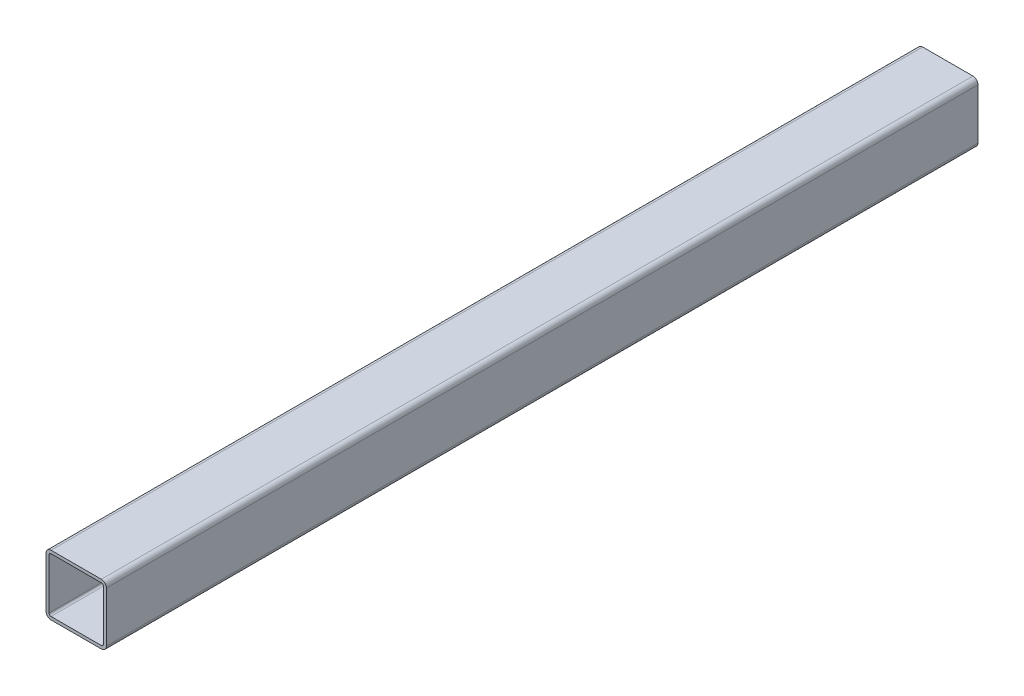
ISO-10303-21;
HEADER;
FILE_DESCRIPTION(('STEP AP214'),'2;1');
FILE_NAME('part.step','',(''),(''),'','','');
FILE_SCHEMA(('AUTOMOTIVE_DESIGN { 1 0 10303 214 1 1 1 1 }'));
ENDSEC;
DATA;
#1=APPLICATION_CONTEXT('core data for automotive mechanical design processes');
#2=APPLICATION_PROTOCOL_DEFINITION('international standard','automotive_design',2000,#1);
#3=PRODUCT_CONTEXT('',#1,'mechanical');
#4=PRODUCT('Part','Part','',(#3));
#5=PRODUCT_RELATED_PRODUCT_CATEGORY('part','',(#4));
#6=PRODUCT_DEFINITION_FORMATION('','',#4);
#7=PRODUCT_DEFINITION_CONTEXT('part definition',#1,'design');
#8=PRODUCT_DEFINITION('design','',#6,#7);
#9=PRODUCT_DEFINITION_SHAPE('','',#8);
#10=(LENGTH_UNIT() NAMED_UNIT(*) SI_UNIT(.MILLI.,.METRE.));
#11=(NAMED_UNIT(*) PLANE_ANGLE_UNIT() SI_UNIT($,.RADIAN.));
#12=(NAMED_UNIT(*) SI_UNIT($,.STERADIAN.) SOLID_ANGLE_UNIT());
#13=UNCERTAINTY_MEASURE_WITH_UNIT(LENGTH_MEASURE(1.E-05),#10,'distance_accuracy_value','');
#14=(GEOMETRIC_REPRESENTATION_CONTEXT(3) GLOBAL_UNCERTAINTY_ASSIGNED_CONTEXT((#13)) GLOBAL_UNIT_ASSIGNED_CONTEXT((#10,
#11,#12)) REPRESENTATION_CONTEXT('',''));
#15=CARTESIAN_POINT('',(0.,0.,0.));
#16=DIRECTION('',(0.,0.,1.));
#17=DIRECTION('',(1.,0.,0.));
#18=AXIS2_PLACEMENT_3D('',#15,#16,#17);
#19=CARTESIAN_POINT('',(25.0000000000004,24.9999999999996,433.));
#20=DIRECTION('',(0.,0.,-1.));
#21=DIRECTION('',(-1.,0.,0.));
#22=AXIS2_PLACEMENT_3D('',#19,#20,#21);
#23=PLANE('',#22);
#24=CARTESIAN_POINT('',(25.0000000000004,24.9999999999996,433.));
#25=DIRECTION('',(0.,0.,1.));
#26=DIRECTION('',(-1.,0.,0.));
#27=AXIS2_PLACEMENT_3D('',#24,#25,#26);
#28=CIRCLE('',#27,5.00000000000001);
#29=CARTESIAN_POINT('',(30.0000000000004,24.9999999999996,433.));
#30=VERTEX_POINT('',#29);
#31=CARTESIAN_POINT('',(25.0000000000004,29.9999999999996,433.));
#32=VERTEX_POINT('',#31);
#33=EDGE_CURVE('E198',#30,#32,#28,.T.);
#34=ORIENTED_EDGE('',*,*,#33,.T.);
#35=DIRECTION('',(-1.,0.,0.));
#36=VECTOR('',#35,1.);
#37=CARTESIAN_POINT('',(-24.9999999999989,29.9999999999996,433.));
#38=LINE('',#37,#36);
#39=CARTESIAN_POINT('',(-24.9999999999989,29.9999999999996,433.));
#40=VERTEX_POINT('',#39);
#41=EDGE_CURVE('E201',#32,#40,#38,.T.);
#42=ORIENTED_EDGE('',*,*,#41,.T.);
#43=CARTESIAN_POINT('',(-24.9999999999989,24.9999999999996,433.));
#44=DIRECTION('',(0.,0.,1.));
#45=DIRECTION('',(-1.,0.,0.));
#46=AXIS2_PLACEMENT_3D('',#43,#44,#45);
#47=CIRCLE('',#46,5.);
#48=CARTESIAN_POINT('',(-29.9999999999989,24.9999999999996,433.));
#49=VERTEX_POINT('',#48);
#50=EDGE_CURVE('E204',#40,#49,#47,.T.);
#51=ORIENTED_EDGE('',*,*,#50,.T.);
#52=DIRECTION('',(0.,-1.,0.));
#53=VECTOR('',#52,1.);
#54=CARTESIAN_POINT('',(-29.9999999999989,-24.9999999999996,433.));
#55=LINE('',#54,#53);
#56=CARTESIAN_POINT('',(-29.9999999999989,-24.9999999999996,433.));
#57=VERTEX_POINT('',#56);
#58=EDGE_CURVE('E206',#49,#57,#55,.T.);
#59=ORIENTED_EDGE('',*,*,#58,.T.);
#60=CARTESIAN_POINT('',(-24.9999999999989,-24.9999999999996,433.));
#61=DIRECTION('',(0.,0.,1.));
#62=DIRECTION('',(-1.,0.,0.));
#63=AXIS2_PLACEMENT_3D('',#60,#61,#62);
#64=CIRCLE('',#63,5.);
#65=CARTESIAN_POINT('',(-24.9999999999989,-29.9999999999996,433.));
#66=VERTEX_POINT('',#65);
#67=EDGE_CURVE('E208',#57,#66,#64,.T.);
#68=ORIENTED_EDGE('',*,*,#67,.T.);
#69=DIRECTION('',(1.,0.,0.));
#70=VECTOR('',#69,1.);
#71=CARTESIAN_POINT('',(-24.9999999999989,-29.9999999999996,433.));
#72=LINE('',#71,#70);
#73=CARTESIAN_POINT('',(25.0000000000004,-29.9999999999996,433.));
#74=VERTEX_POINT('',#73);
#75=EDGE_CURVE('E210',#66,#74,#72,.T.);
#76=ORIENTED_EDGE('',*,*,#75,.T.);
#77=CARTESIAN_POINT('',(25.0000000000004,-24.9999999999996,433.));
#78=DIRECTION('',(0.,0.,1.));
#79=DIRECTION('',(1.,0.,0.));
#80=AXIS2_PLACEMENT_3D('',#77,#78,#79);
#81=CIRCLE('',#80,5.);
#82=CARTESIAN_POINT('',(30.0000000000004,-24.9999999999996,433.));
#83=VERTEX_POINT('',#82);
#84=EDGE_CURVE('E212',#74,#83,#81,.T.);
#85=ORIENTED_EDGE('',*,*,#84,.T.);
#86=DIRECTION('',(0.,1.,0.));
#87=VECTOR('',#86,1.);
#88=CARTESIAN_POINT('',(30.0000000000004,-24.9999999999996,433.));
#89=LINE('',#88,#87);
#90=EDGE_CURVE('E214',#83,#30,#89,.T.);
#91=ORIENTED_EDGE('',*,*,#90,.T.);
#92=EDGE_LOOP('',(#34,#42,#51,#59,#68,#76,#85,#91));
#93=FACE_BOUND('',#92,.T.);
#94=CARTESIAN_POINT('',(25.0000000000004,24.9999999999996,433.));
#95=DIRECTION('',(0.,0.,-1.));
#96=DIRECTION('',(-1.,0.,0.));
#97=AXIS2_PLACEMENT_3D('',#94,#95,#96);
#98=CIRCLE('',#97,2.00000000000001);
#99=CARTESIAN_POINT('',(27.0000000000004,24.9999999999996,433.));
#100=VERTEX_POINT('',#99);
#101=CARTESIAN_POINT('',(25.0000000000004,26.9999999999996,433.));
#102=VERTEX_POINT('',#101);
#103=EDGE_CURVE('E169',#100,#102,#98,.F.);
#104=ORIENTED_EDGE('',*,*,#103,.F.);
#105=DIRECTION('',(0.,1.,0.));
#106=VECTOR('',#105,1.);
#107=CARTESIAN_POINT('',(27.0000000000004,24.9999999999996,433.));
#108=LINE('',#107,#106);
#109=CARTESIAN_POINT('',(27.0000000000004,-24.9999999999996,433.));
#110=VERTEX_POINT('',#109);
#111=EDGE_CURVE('E151',#110,#100,#108,.T.);
#112=ORIENTED_EDGE('',*,*,#111,.F.);
#113=CARTESIAN_POINT('',(25.0000000000004,-24.9999999999996,433.));
#114=DIRECTION('',(0.,0.,-1.));
#115=DIRECTION('',(-1.,0.,0.));
#116=AXIS2_PLACEMENT_3D('',#113,#114,#115);
#117=CIRCLE('',#116,2.);
#118=CARTESIAN_POINT('',(25.0000000000003,-26.9999999999996,433.));
#119=VERTEX_POINT('',#118);
#120=EDGE_CURVE('E195',#119,#110,#117,.F.);
#121=ORIENTED_EDGE('',*,*,#120,.F.);
#122=DIRECTION('',(1.,0.,0.));
#123=VECTOR('',#122,1.);
#124=CARTESIAN_POINT('',(25.0000000000004,-26.9999999999996,433.));
#125=LINE('',#124,#123);
#126=CARTESIAN_POINT('',(-24.9999999999989,-26.9999999999996,433.));
#127=VERTEX_POINT('',#126);
#128=EDGE_CURVE('E193',#127,#119,#125,.T.);
#129=ORIENTED_EDGE('',*,*,#128,.F.);
#130=CARTESIAN_POINT('',(-24.9999999999989,-24.9999999999996,433.));
#131=DIRECTION('',(0.,0.,-1.));
#132=DIRECTION('',(-1.,0.,0.));
#133=AXIS2_PLACEMENT_3D('',#130,#131,#132);
#134=CIRCLE('',#133,2.);
#135=CARTESIAN_POINT('',(-26.9999999999989,-24.9999999999996,433.));
#136=VERTEX_POINT('',#135);
#137=EDGE_CURVE('E191',#136,#127,#134,.F.);
#138=ORIENTED_EDGE('',*,*,#137,.F.);
#139=DIRECTION('',(0.,-1.,0.));
#140=VECTOR('',#139,1.);
#141=CARTESIAN_POINT('',(-26.9999999999989,24.9999999999996,433.));
#142=LINE('',#141,#140);
#143=CARTESIAN_POINT('',(-26.9999999999989,24.9999999999996,433.));
#144=VERTEX_POINT('',#143);
#145=EDGE_CURVE('E189',#144,#136,#142,.T.);
#146=ORIENTED_EDGE('',*,*,#145,.F.);
#147=CARTESIAN_POINT('',(-24.9999999999989,24.9999999999996,433.));
#148=DIRECTION('',(0.,0.,-1.));
#149=DIRECTION('',(-1.,0.,0.));
#150=AXIS2_PLACEMENT_3D('',#147,#148,#149);
#151=CIRCLE('',#150,2.);
#152=CARTESIAN_POINT('',(-24.9999999999989,26.9999999999996,433.));
#153=VERTEX_POINT('',#152);
#154=EDGE_CURVE('E187',#153,#144,#151,.F.);
#155=ORIENTED_EDGE('',*,*,#154,.F.);
#156=DIRECTION('',(-1.,0.,0.));
#157=VECTOR('',#156,1.);
#158=CARTESIAN_POINT('',(25.0000000000004,26.9999999999996,433.));
#159=LINE('',#158,#157);
#160=EDGE_CURVE('E171',#102,#153,#159,.T.);
#161=ORIENTED_EDGE('',*,*,#160,.F.);
#162=EDGE_LOOP('',(#104,#112,#121,#129,#138,#146,#155,#161));
#163=FACE_BOUND('',#162,.T.);
#164=ADVANCED_FACE('F32',(#93,#163),#23,.F.);
#165=CARTESIAN_POINT('',(25.0000000000004,24.9999999999996,-433.));
#166=DIRECTION('',(0.,0.,-1.));
#167=DIRECTION('',(-1.,0.,0.));
#168=AXIS2_PLACEMENT_3D('',#165,#166,#167);
#169=PLANE('',#168);
#170=CARTESIAN_POINT('',(25.0000000000004,24.9999999999996,-433.));
#171=DIRECTION('',(0.,0.,1.));
#172=DIRECTION('',(-1.,0.,0.));
#173=AXIS2_PLACEMENT_3D('',#170,#171,#172);
#174=CIRCLE('',#173,5.00000000000001);
#175=CARTESIAN_POINT('',(30.0000000000004,24.9999999999996,-433.));
#176=VERTEX_POINT('',#175);
#177=CARTESIAN_POINT('',(25.0000000000004,29.9999999999996,-433.));
#178=VERTEX_POINT('',#177);
#179=EDGE_CURVE('E217',#176,#178,#174,.T.);
#180=ORIENTED_EDGE('',*,*,#179,.F.);
#181=DIRECTION('',(0.,1.,0.));
#182=VECTOR('',#181,1.);
#183=CARTESIAN_POINT('',(30.0000000000004,-24.9999999999996,-433.));
#184=LINE('',#183,#182);
#185=CARTESIAN_POINT('',(30.0000000000004,-24.9999999999996,-433.));
#186=VERTEX_POINT('',#185);
#187=EDGE_CURVE('E202',#186,#176,#184,.T.);
#188=ORIENTED_EDGE('',*,*,#187,.F.);
#189=CARTESIAN_POINT('',(25.0000000000004,-24.9999999999996,-433.));
#190=DIRECTION('',(0.,0.,1.));
#191=DIRECTION('',(1.,0.,0.));
#192=AXIS2_PLACEMENT_3D('',#189,#190,#191);
#193=CIRCLE('',#192,5.);
#194=CARTESIAN_POINT('',(25.0000000000004,-29.9999999999996,-433.));
#195=VERTEX_POINT('',#194);
#196=EDGE_CURVE('E230',#195,#186,#193,.T.);
#197=ORIENTED_EDGE('',*,*,#196,.F.);
#198=DIRECTION('',(1.,0.,0.));
#199=VECTOR('',#198,1.);
#200=CARTESIAN_POINT('',(-24.9999999999989,-29.9999999999996,-433.));
#201=LINE('',#200,#199);
#202=CARTESIAN_POINT('',(-24.9999999999989,-29.9999999999996,-433.));
#203=VERTEX_POINT('',#202);
#204=EDGE_CURVE('E228',#203,#195,#201,.T.);
#205=ORIENTED_EDGE('',*,*,#204,.F.);
#206=CARTESIAN_POINT('',(-24.9999999999989,-24.9999999999996,-433.));
#207=DIRECTION('',(0.,0.,1.));
#208=DIRECTION('',(-1.,0.,0.));
#209=AXIS2_PLACEMENT_3D('',#206,#207,#208);
#210=CIRCLE('',#209,5.);
#211=CARTESIAN_POINT('',(-29.9999999999989,-24.9999999999996,-433.));
#212=VERTEX_POINT('',#211);
#213=EDGE_CURVE('E226',#212,#203,#210,.T.);
#214=ORIENTED_EDGE('',*,*,#213,.F.);
#215=DIRECTION('',(0.,-1.,0.));
#216=VECTOR('',#215,1.);
#217=CARTESIAN_POINT('',(-29.9999999999989,-24.9999999999996,-433.));
#218=LINE('',#217,#216);
#219=CARTESIAN_POINT('',(-29.9999999999989,24.9999999999996,-433.));
#220=VERTEX_POINT('',#219);
#221=EDGE_CURVE('E224',#220,#212,#218,.T.);
#222=ORIENTED_EDGE('',*,*,#221,.F.);
#223=CARTESIAN_POINT('',(-24.9999999999989,24.9999999999996,-433.));
#224=DIRECTION('',(0.,0.,1.));
#225=DIRECTION('',(-1.,0.,0.));
#226=AXIS2_PLACEMENT_3D('',#223,#224,#225);
#227=CIRCLE('',#226,5.);
#228=CARTESIAN_POINT('',(-24.9999999999989,29.9999999999996,-433.));
#229=VERTEX_POINT('',#228);
#230=EDGE_CURVE('E222',#229,#220,#227,.T.);
#231=ORIENTED_EDGE('',*,*,#230,.F.);
#232=DIRECTION('',(-1.,0.,0.));
#233=VECTOR('',#232,1.);
#234=CARTESIAN_POINT('',(-24.9999999999989,29.9999999999996,-433.));
#235=LINE('',#234,#233);
#236=EDGE_CURVE('E220',#178,#229,#235,.T.);
#237=ORIENTED_EDGE('',*,*,#236,.F.);
#238=EDGE_LOOP('',(#180,#188,#197,#205,#214,#222,#231,#237));
#239=FACE_BOUND('',#238,.T.);
#240=DIRECTION('',(0.,1.,0.));
#241=VECTOR('',#240,1.);
#242=CARTESIAN_POINT('',(27.0000000000004,24.9999999999996,-433.));
#243=LINE('',#242,#241);
#244=CARTESIAN_POINT('',(27.0000000000004,-24.9999999999996,-433.));
#245=VERTEX_POINT('',#244);
#246=CARTESIAN_POINT('',(27.0000000000004,24.9999999999996,-433.));
#247=VERTEX_POINT('',#246);
#248=EDGE_CURVE('E148',#245,#247,#243,.T.);
#249=ORIENTED_EDGE('',*,*,#248,.T.);
#250=CARTESIAN_POINT('',(25.0000000000004,24.9999999999996,-433.));
#251=DIRECTION('',(0.,0.,-1.));
#252=DIRECTION('',(-1.,0.,0.));
#253=AXIS2_PLACEMENT_3D('',#250,#251,#252);
#254=CIRCLE('',#253,2.00000000000001);
#255=CARTESIAN_POINT('',(25.0000000000004,26.9999999999996,-433.));
#256=VERTEX_POINT('',#255);
#257=EDGE_CURVE('E157',#247,#256,#254,.F.);
#258=ORIENTED_EDGE('',*,*,#257,.T.);
#259=DIRECTION('',(-1.,0.,0.));
#260=VECTOR('',#259,1.);
#261=CARTESIAN_POINT('',(25.0000000000004,26.9999999999996,-433.));
#262=LINE('',#261,#260);
#263=CARTESIAN_POINT('',(-24.9999999999989,26.9999999999996,-433.));
#264=VERTEX_POINT('',#263);
#265=EDGE_CURVE('E163',#256,#264,#262,.T.);
#266=ORIENTED_EDGE('',*,*,#265,.T.);
#267=CARTESIAN_POINT('',(-24.9999999999989,24.9999999999996,-433.));
#268=DIRECTION('',(0.,0.,-1.));
#269=DIRECTION('',(-1.,0.,0.));
#270=AXIS2_PLACEMENT_3D('',#267,#268,#269);
#271=CIRCLE('',#270,2.);
#272=CARTESIAN_POINT('',(-26.9999999999989,24.9999999999996,-433.));
#273=VERTEX_POINT('',#272);
#274=EDGE_CURVE('E55',#264,#273,#271,.F.);
#275=ORIENTED_EDGE('',*,*,#274,.T.);
#276=DIRECTION('',(0.,-1.,0.));
#277=VECTOR('',#276,1.);
#278=CARTESIAN_POINT('',(-26.9999999999989,24.9999999999996,-433.));
#279=LINE('',#278,#277);
#280=CARTESIAN_POINT('',(-26.9999999999989,-24.9999999999996,-433.));
#281=VERTEX_POINT('',#280);
#282=EDGE_CURVE('E181',#273,#281,#279,.T.);
#283=ORIENTED_EDGE('',*,*,#282,.T.);
#284=CARTESIAN_POINT('',(-24.9999999999989,-24.9999999999996,-433.));
#285=DIRECTION('',(0.,0.,-1.));
#286=DIRECTION('',(-1.,0.,0.));
#287=AXIS2_PLACEMENT_3D('',#284,#285,#286);
#288=CIRCLE('',#287,2.);
#289=CARTESIAN_POINT('',(-24.9999999999989,-26.9999999999996,-433.));
#290=VERTEX_POINT('',#289);
#291=EDGE_CURVE('E178',#281,#290,#288,.F.);
#292=ORIENTED_EDGE('',*,*,#291,.T.);
#293=DIRECTION('',(1.,0.,0.));
#294=VECTOR('',#293,1.);
#295=CARTESIAN_POINT('',(25.0000000000004,-26.9999999999996,-433.));
#296=LINE('',#295,#294);
#297=CARTESIAN_POINT('',(25.0000000000003,-26.9999999999996,-433.));
#298=VERTEX_POINT('',#297);
#299=EDGE_CURVE('E173',#290,#298,#296,.T.);
#300=ORIENTED_EDGE('',*,*,#299,.T.);
#301=CARTESIAN_POINT('',(25.0000000000004,-24.9999999999996,-433.));
#302=DIRECTION('',(0.,0.,-1.));
#303=DIRECTION('',(-1.,0.,0.));
#304=AXIS2_PLACEMENT_3D('',#301,#302,#303);
#305=CIRCLE('',#304,2.);
#306=EDGE_CURVE('E168',#298,#245,#305,.F.);
#307=ORIENTED_EDGE('',*,*,#306,.T.);
#308=EDGE_LOOP('',(#249,#258,#266,#275,#283,#292,#300,#307));
#309=FACE_BOUND('',#308,.T.);
#310=ADVANCED_FACE('F165',(#239,#309),#169,.T.);
#311=CARTESIAN_POINT('',(25.0000000000004,24.9999999999996,433.));
#312=DIRECTION('',(0.,0.,-1.));
#313=DIRECTION('',(-1.,0.,0.));
#314=AXIS2_PLACEMENT_3D('',#311,#312,#313);
#315=CYLINDRICAL_SURFACE('',#314,5.00000000000001);
#316=ORIENTED_EDGE('',*,*,#179,.T.);
#317=DIRECTION('',(0.,0.,-1.));
#318=VECTOR('',#317,1.);
#319=CARTESIAN_POINT('',(25.0000000000004,29.9999999999996,433.));
#320=LINE('',#319,#318);
#321=EDGE_CURVE('E11',#32,#178,#320,.T.);
#322=ORIENTED_EDGE('',*,*,#321,.F.);
#323=ORIENTED_EDGE('',*,*,#33,.F.);
#324=DIRECTION('',(0.,0.,-1.));
#325=VECTOR('',#324,1.);
#326=CARTESIAN_POINT('',(30.0000000000004,24.9999999999996,433.));
#327=LINE('',#326,#325);
#328=EDGE_CURVE('E216',#30,#176,#327,.T.);
#329=ORIENTED_EDGE('',*,*,#328,.T.);
#330=EDGE_LOOP('',(#316,#322,#323,#329));
#331=FACE_BOUND('',#330,.T.);
#332=ADVANCED_FACE('F34',(#331),#315,.T.);
#333=CARTESIAN_POINT('',(-24.9999999999989,29.9999999999996,433.));
#334=DIRECTION('',(0.,-1.,0.));
#335=DIRECTION('',(1.,0.,0.));
#336=AXIS2_PLACEMENT_3D('',#333,#334,#335);
#337=PLANE('',#336);
#338=ORIENTED_EDGE('',*,*,#236,.T.);
#339=DIRECTION('',(0.,0.,-1.));
#340=VECTOR('',#339,1.);
#341=CARTESIAN_POINT('',(-24.9999999999989,29.9999999999996,433.));
#342=LINE('',#341,#340);
#343=EDGE_CURVE('E40',#40,#229,#342,.T.);
#344=ORIENTED_EDGE('',*,*,#343,.F.);
#345=ORIENTED_EDGE('',*,*,#41,.F.);
#346=ORIENTED_EDGE('',*,*,#321,.T.);
#347=EDGE_LOOP('',(#338,#344,#345,#346));
#348=FACE_BOUND('',#347,.T.);
#349=ADVANCED_FACE('F276',(#348),#337,.F.);
#350=CARTESIAN_POINT('',(-24.9999999999989,24.9999999999996,433.));
#351=DIRECTION('',(0.,0.,-1.));
#352=DIRECTION('',(-1.,0.,0.));
#353=AXIS2_PLACEMENT_3D('',#350,#351,#352);
#354=CYLINDRICAL_SURFACE('',#353,5.);
#355=ORIENTED_EDGE('',*,*,#230,.T.);
#356=DIRECTION('',(0.,0.,-1.));
#357=VECTOR('',#356,1.);
#358=CARTESIAN_POINT('',(-29.9999999999989,24.9999999999996,433.));
#359=LINE('',#358,#357);
#360=EDGE_CURVE('E247',#49,#220,#359,.T.);
#361=ORIENTED_EDGE('',*,*,#360,.F.);
#362=ORIENTED_EDGE('',*,*,#50,.F.);
#363=ORIENTED_EDGE('',*,*,#343,.T.);
#364=EDGE_LOOP('',(#355,#361,#362,#363));
#365=FACE_BOUND('',#364,.T.);
#366=ADVANCED_FACE('F254',(#365),#354,.T.);
#367=CARTESIAN_POINT('',(-29.9999999999989,-24.9999999999996,433.));
#368=DIRECTION('',(1.,0.,0.));
#369=DIRECTION('',(0.,1.,0.));
#370=AXIS2_PLACEMENT_3D('',#367,#368,#369);
#371=PLANE('',#370);
#372=ORIENTED_EDGE('',*,*,#221,.T.);
#373=DIRECTION('',(0.,0.,-1.));
#374=VECTOR('',#373,1.);
#375=CARTESIAN_POINT('',(-29.9999999999989,-24.9999999999996,433.));
#376=LINE('',#375,#374);
#377=EDGE_CURVE('E244',#57,#212,#376,.T.);
#378=ORIENTED_EDGE('',*,*,#377,.F.);
#379=ORIENTED_EDGE('',*,*,#58,.F.);
#380=ORIENTED_EDGE('',*,*,#360,.T.);
#381=EDGE_LOOP('',(#372,#378,#379,#380));
#382=FACE_BOUND('',#381,.T.);
#383=ADVANCED_FACE('F264',(#382),#371,.F.);
#384=CARTESIAN_POINT('',(-24.9999999999989,-24.9999999999996,433.));
#385=DIRECTION('',(0.,0.,-1.));
#386=DIRECTION('',(-1.,0.,0.));
#387=AXIS2_PLACEMENT_3D('',#384,#385,#386);
#388=CYLINDRICAL_SURFACE('',#387,5.);
#389=ORIENTED_EDGE('',*,*,#213,.T.);
#390=DIRECTION('',(0.,0.,-1.));
#391=VECTOR('',#390,1.);
#392=CARTESIAN_POINT('',(-24.9999999999989,-29.9999999999996,433.));
#393=LINE('',#392,#391);
#394=EDGE_CURVE('E241',#66,#203,#393,.T.);
#395=ORIENTED_EDGE('',*,*,#394,.F.);
#396=ORIENTED_EDGE('',*,*,#67,.F.);
#397=ORIENTED_EDGE('',*,*,#377,.T.);
#398=EDGE_LOOP('',(#389,#395,#396,#397));
#399=FACE_BOUND('',#398,.T.);
#400=ADVANCED_FACE('F268',(#399),#388,.T.);
#401=CARTESIAN_POINT('',(-24.9999999999989,-29.9999999999996,433.));
#402=DIRECTION('',(0.,1.,0.));
#403=DIRECTION('',(0.,0.,1.));
#404=AXIS2_PLACEMENT_3D('',#401,#402,#403);
#405=PLANE('',#404);
#406=ORIENTED_EDGE('',*,*,#204,.T.);
#407=DIRECTION('',(0.,0.,-1.));
#408=VECTOR('',#407,1.);
#409=CARTESIAN_POINT('',(25.0000000000004,-29.9999999999996,433.));
#410=LINE('',#409,#408);
#411=EDGE_CURVE('E238',#74,#195,#410,.T.);
#412=ORIENTED_EDGE('',*,*,#411,.F.);
#413=ORIENTED_EDGE('',*,*,#75,.F.);
#414=ORIENTED_EDGE('',*,*,#394,.T.);
#415=EDGE_LOOP('',(#406,#412,#413,#414));
#416=FACE_BOUND('',#415,.T.);
#417=ADVANCED_FACE('F289',(#416),#405,.F.);
#418=CARTESIAN_POINT('',(25.0000000000004,-24.9999999999996,433.));
#419=DIRECTION('',(0.,0.,-1.));
#420=DIRECTION('',(-1.,0.,0.));
#421=AXIS2_PLACEMENT_3D('',#418,#419,#420);
#422=CYLINDRICAL_SURFACE('',#421,5.);
#423=ORIENTED_EDGE('',*,*,#196,.T.);
#424=DIRECTION('',(0.,0.,-1.));
#425=VECTOR('',#424,1.);
#426=CARTESIAN_POINT('',(30.0000000000004,-24.9999999999996,433.));
#427=LINE('',#426,#425);
#428=EDGE_CURVE('E235',#83,#186,#427,.T.);
#429=ORIENTED_EDGE('',*,*,#428,.F.);
#430=ORIENTED_EDGE('',*,*,#84,.F.);
#431=ORIENTED_EDGE('',*,*,#411,.T.);
#432=EDGE_LOOP('',(#423,#429,#430,#431));
#433=FACE_BOUND('',#432,.T.);
#434=ADVANCED_FACE('F287',(#433),#422,.T.);
#435=CARTESIAN_POINT('',(30.0000000000004,-24.9999999999996,433.));
#436=DIRECTION('',(-1.,0.,0.));
#437=DIRECTION('',(0.,-1.,0.));
#438=AXIS2_PLACEMENT_3D('',#435,#436,#437);
#439=PLANE('',#438);
#440=ORIENTED_EDGE('',*,*,#187,.T.);
#441=ORIENTED_EDGE('',*,*,#328,.F.);
#442=ORIENTED_EDGE('',*,*,#90,.F.);
#443=ORIENTED_EDGE('',*,*,#428,.T.);
#444=EDGE_LOOP('',(#440,#441,#442,#443));
#445=FACE_BOUND('',#444,.T.);
#446=ADVANCED_FACE('F282',(#445),#439,.F.);
#447=CARTESIAN_POINT('',(25.0000000000004,24.9999999999996,433.));
#448=DIRECTION('',(0.,0.,-1.));
#449=DIRECTION('',(-1.,0.,0.));
#450=AXIS2_PLACEMENT_3D('',#447,#448,#449);
#451=CYLINDRICAL_SURFACE('',#450,2.00000000000001);
#452=ORIENTED_EDGE('',*,*,#257,.F.);
#453=DIRECTION('',(0.,0.,-1.));
#454=VECTOR('',#453,1.);
#455=CARTESIAN_POINT('',(27.0000000000004,24.9999999999996,433.));
#456=LINE('',#455,#454);
#457=EDGE_CURVE('E144',#100,#247,#456,.T.);
#458=ORIENTED_EDGE('',*,*,#457,.F.);
#459=ORIENTED_EDGE('',*,*,#103,.T.);
#460=DIRECTION('',(0.,0.,1.));
#461=VECTOR('',#460,1.);
#462=CARTESIAN_POINT('',(25.0000000000004,26.9999999999996,433.));
#463=LINE('',#462,#461);
#464=EDGE_CURVE('E160',#102,#256,#463,.F.);
#465=ORIENTED_EDGE('',*,*,#464,.T.);
#466=EDGE_LOOP('',(#452,#458,#459,#465));
#467=FACE_BOUND('',#466,.T.);
#468=ADVANCED_FACE('F158',(#467),#451,.F.);
#469=CARTESIAN_POINT('',(-24.9999999999989,26.9999999999996,433.));
#470=DIRECTION('',(0.,-1.,0.));
#471=DIRECTION('',(1.,0.,0.));
#472=AXIS2_PLACEMENT_3D('',#469,#470,#471);
#473=PLANE('',#472);
#474=ORIENTED_EDGE('',*,*,#265,.F.);
#475=ORIENTED_EDGE('',*,*,#464,.F.);
#476=ORIENTED_EDGE('',*,*,#160,.T.);
#477=DIRECTION('',(0.,0.,-1.));
#478=VECTOR('',#477,1.);
#479=CARTESIAN_POINT('',(-24.9999999999989,26.9999999999996,433.));
#480=LINE('',#479,#478);
#481=EDGE_CURVE('E354',#153,#264,#480,.T.);
#482=ORIENTED_EDGE('',*,*,#481,.T.);
#483=EDGE_LOOP('',(#474,#475,#476,#482));
#484=FACE_BOUND('',#483,.T.);
#485=ADVANCED_FACE('F311',(#484),#473,.T.);
#486=CARTESIAN_POINT('',(-24.9999999999989,24.9999999999996,433.));
#487=DIRECTION('',(0.,0.,-1.));
#488=DIRECTION('',(-1.,0.,0.));
#489=AXIS2_PLACEMENT_3D('',#486,#487,#488);
#490=CYLINDRICAL_SURFACE('',#489,2.);
#491=ORIENTED_EDGE('',*,*,#274,.F.);
#492=ORIENTED_EDGE('',*,*,#481,.F.);
#493=ORIENTED_EDGE('',*,*,#154,.T.);
#494=DIRECTION('',(0.,0.,1.));
#495=VECTOR('',#494,1.);
#496=CARTESIAN_POINT('',(-26.9999999999989,24.9999999999996,433.));
#497=LINE('',#496,#495);
#498=EDGE_CURVE('E352',#144,#273,#497,.F.);
#499=ORIENTED_EDGE('',*,*,#498,.T.);
#500=EDGE_LOOP('',(#491,#492,#493,#499));
#501=FACE_BOUND('',#500,.T.);
#502=ADVANCED_FACE('F316',(#501),#490,.F.);
#503=CARTESIAN_POINT('',(-26.9999999999989,-24.9999999999996,433.));
#504=DIRECTION('',(1.,0.,0.));
#505=DIRECTION('',(0.,1.,0.));
#506=AXIS2_PLACEMENT_3D('',#503,#504,#505);
#507=PLANE('',#506);
#508=ORIENTED_EDGE('',*,*,#282,.F.);
#509=ORIENTED_EDGE('',*,*,#498,.F.);
#510=ORIENTED_EDGE('',*,*,#145,.T.);
#511=DIRECTION('',(0.,0.,-1.));
#512=VECTOR('',#511,1.);
#513=CARTESIAN_POINT('',(-26.9999999999989,-24.9999999999996,433.));
#514=LINE('',#513,#512);
#515=EDGE_CURVE('E348',#136,#281,#514,.T.);
#516=ORIENTED_EDGE('',*,*,#515,.T.);
#517=EDGE_LOOP('',(#508,#509,#510,#516));
#518=FACE_BOUND('',#517,.T.);
#519=ADVANCED_FACE('F322',(#518),#507,.T.);
#520=CARTESIAN_POINT('',(-24.9999999999989,-24.9999999999996,433.));
#521=DIRECTION('',(0.,0.,-1.));
#522=DIRECTION('',(-1.,0.,0.));
#523=AXIS2_PLACEMENT_3D('',#520,#521,#522);
#524=CYLINDRICAL_SURFACE('',#523,2.);
#525=ORIENTED_EDGE('',*,*,#291,.F.);
#526=ORIENTED_EDGE('',*,*,#515,.F.);
#527=ORIENTED_EDGE('',*,*,#137,.T.);
#528=DIRECTION('',(0.,0.,1.));
#529=VECTOR('',#528,1.);
#530=CARTESIAN_POINT('',(-24.9999999999989,-26.9999999999996,433.));
#531=LINE('',#530,#529);
#532=EDGE_CURVE('E345',#127,#290,#531,.F.);
#533=ORIENTED_EDGE('',*,*,#532,.T.);
#534=EDGE_LOOP('',(#525,#526,#527,#533));
#535=FACE_BOUND('',#534,.T.);
#536=ADVANCED_FACE('F325',(#535),#524,.F.);
#537=CARTESIAN_POINT('',(-24.9999999999989,-26.9999999999996,433.));
#538=DIRECTION('',(0.,1.,0.));
#539=DIRECTION('',(0.,0.,1.));
#540=AXIS2_PLACEMENT_3D('',#537,#538,#539);
#541=PLANE('',#540);
#542=ORIENTED_EDGE('',*,*,#299,.F.);
#543=ORIENTED_EDGE('',*,*,#532,.F.);
#544=ORIENTED_EDGE('',*,*,#128,.T.);
#545=DIRECTION('',(0.,0.,-1.));
#546=VECTOR('',#545,1.);
#547=CARTESIAN_POINT('',(25.0000000000004,-26.9999999999996,433.));
#548=LINE('',#547,#546);
#549=EDGE_CURVE('E340',#119,#298,#548,.T.);
#550=ORIENTED_EDGE('',*,*,#549,.T.);
#551=EDGE_LOOP('',(#542,#543,#544,#550));
#552=FACE_BOUND('',#551,.T.);
#553=ADVANCED_FACE('F329',(#552),#541,.T.);
#554=CARTESIAN_POINT('',(25.0000000000004,-24.9999999999996,433.));
#555=DIRECTION('',(0.,0.,-1.));
#556=DIRECTION('',(-1.,0.,0.));
#557=AXIS2_PLACEMENT_3D('',#554,#555,#556);
#558=CYLINDRICAL_SURFACE('',#557,2.);
#559=ORIENTED_EDGE('',*,*,#306,.F.);
#560=ORIENTED_EDGE('',*,*,#549,.F.);
#561=ORIENTED_EDGE('',*,*,#120,.T.);
#562=DIRECTION('',(0.,0.,1.));
#563=VECTOR('',#562,1.);
#564=CARTESIAN_POINT('',(27.0000000000004,-24.9999999999996,433.));
#565=LINE('',#564,#563);
#566=EDGE_CURVE('E47',#110,#245,#565,.F.);
#567=ORIENTED_EDGE('',*,*,#566,.T.);
#568=EDGE_LOOP('',(#559,#560,#561,#567));
#569=FACE_BOUND('',#568,.T.);
#570=ADVANCED_FACE('F332',(#569),#558,.F.);
#571=CARTESIAN_POINT('',(27.0000000000004,-24.9999999999996,433.));
#572=DIRECTION('',(-1.,0.,0.));
#573=DIRECTION('',(0.,-1.,0.));
#574=AXIS2_PLACEMENT_3D('',#571,#572,#573);
#575=PLANE('',#574);
#576=ORIENTED_EDGE('',*,*,#248,.F.);
#577=ORIENTED_EDGE('',*,*,#566,.F.);
#578=ORIENTED_EDGE('',*,*,#111,.T.);
#579=ORIENTED_EDGE('',*,*,#457,.T.);
#580=EDGE_LOOP('',(#576,#577,#578,#579));
#581=FACE_BOUND('',#580,.T.);
#582=ADVANCED_FACE('F146',(#581),#575,.T.);
#583=CLOSED_SHELL('',(#164,#310,#332,#349,#366,#383,#400,#417,#434,#446,#468,#485,#502,#519,
#536,#553,#570,#582));
#584=MANIFOLD_SOLID_BREP('B2',#583);
#585=ADVANCED_BREP_SHAPE_REPRESENTATION('',(#18,#584),#14);
#586=SHAPE_DEFINITION_REPRESENTATION(#9,#585);
ENDSEC;
END-ISO-10303-21;
